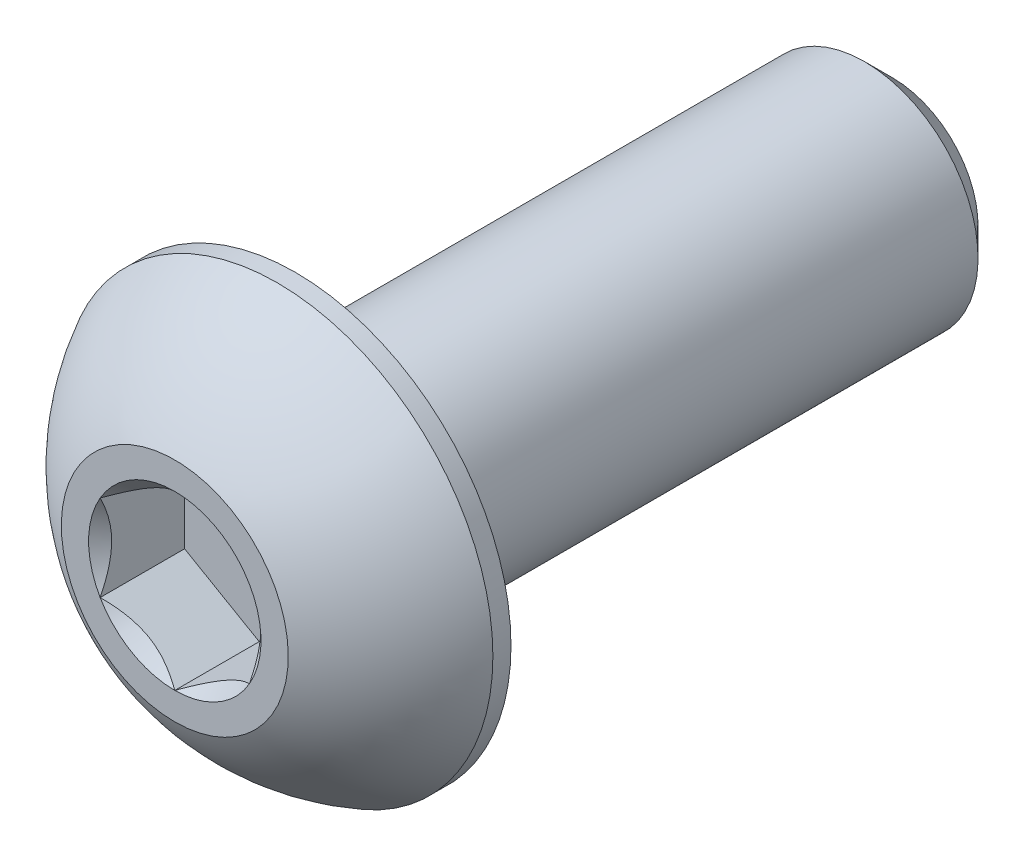
ISO-10303-21;
HEADER;
FILE_DESCRIPTION(('STEP AP214'),'2;1');
FILE_NAME('part.step','',(''),(''),'','','');
FILE_SCHEMA(('AUTOMOTIVE_DESIGN { 1 0 10303 214 1 1 1 1 }'));
ENDSEC;
DATA;
#1=APPLICATION_CONTEXT('core data for automotive mechanical design processes');
#2=APPLICATION_PROTOCOL_DEFINITION('international standard','automotive_design',2000,#1);
#3=PRODUCT_CONTEXT('',#1,'mechanical');
#4=PRODUCT('Part','Part','',(#3));
#5=PRODUCT_RELATED_PRODUCT_CATEGORY('part','',(#4));
#6=PRODUCT_DEFINITION_FORMATION('','',#4);
#7=PRODUCT_DEFINITION_CONTEXT('part definition',#1,'design');
#8=PRODUCT_DEFINITION('design','',#6,#7);
#9=PRODUCT_DEFINITION_SHAPE('','',#8);
#10=(LENGTH_UNIT() NAMED_UNIT(*) SI_UNIT(.MILLI.,.METRE.));
#11=(NAMED_UNIT(*) PLANE_ANGLE_UNIT() SI_UNIT($,.RADIAN.));
#12=(NAMED_UNIT(*) SI_UNIT($,.STERADIAN.) SOLID_ANGLE_UNIT());
#13=UNCERTAINTY_MEASURE_WITH_UNIT(LENGTH_MEASURE(1.E-05),#10,'distance_accuracy_value','');
#14=(GEOMETRIC_REPRESENTATION_CONTEXT(3) GLOBAL_UNCERTAINTY_ASSIGNED_CONTEXT((#13)) GLOBAL_UNIT_ASSIGNED_CONTEXT((#10,
#11,#12)) REPRESENTATION_CONTEXT('',''));
#15=CARTESIAN_POINT('',(0.,0.,0.));
#16=DIRECTION('',(0.,0.,1.));
#17=DIRECTION('',(1.,0.,0.));
#18=AXIS2_PLACEMENT_3D('',#15,#16,#17);
#19=CARTESIAN_POINT('',(0.,-2.41300000000001,-15.2654));
#20=DIRECTION('',(0.,0.,-1.));
#21=DIRECTION('',(0.,1.,0.));
#22=AXIS2_PLACEMENT_3D('',#19,#20,#21);
#23=PLANE('',#22);
#24=CARTESIAN_POINT('',(0.,0.,-15.2654));
#25=DIRECTION('',(0.,0.,-1.));
#26=DIRECTION('',(0.,1.,0.));
#27=AXIS2_PLACEMENT_3D('',#24,#25,#26);
#28=CIRCLE('',#27,1.81768750000001);
#29=CARTESIAN_POINT('',(0.,1.8176875,-15.2654));
#30=VERTEX_POINT('',#29);
#31=EDGE_CURVE('E44',#30,#30,#28,.T.);
#32=ORIENTED_EDGE('',*,*,#31,.T.);
#33=EDGE_LOOP('',(#32));
#34=FACE_BOUND('',#33,.T.);
#35=ADVANCED_FACE('F36',(#34),#23,.T.);
#36=CARTESIAN_POINT('',(0.,0.,-15.2654));
#37=DIRECTION('',(0.,0.,-1.));
#38=DIRECTION('',(0.,1.,0.));
#39=AXIS2_PLACEMENT_3D('',#36,#37,#38);
#40=CYLINDRICAL_SURFACE('',#39,2.413);
#41=CARTESIAN_POINT('',(0.,0.,-14.6700875));
#42=DIRECTION('',(0.,0.,-1.));
#43=DIRECTION('',(0.,1.,0.));
#44=AXIS2_PLACEMENT_3D('',#41,#42,#43);
#45=CIRCLE('',#44,2.413);
#46=CARTESIAN_POINT('',(0.,2.413,-14.6700875));
#47=VERTEX_POINT('',#46);
#48=EDGE_CURVE('E11',#47,#47,#45,.F.);
#49=ORIENTED_EDGE('',*,*,#48,.T.);
#50=EDGE_LOOP('',(#49));
#51=FACE_BOUND('',#50,.T.);
#52=CARTESIAN_POINT('',(0.,0.,-2.5654));
#53=DIRECTION('',(0.,0.,1.));
#54=DIRECTION('',(1.,0.,0.));
#55=AXIS2_PLACEMENT_3D('',#52,#53,#54);
#56=CIRCLE('',#55,2.413);
#57=CARTESIAN_POINT('',(2.413,0.,-2.5654));
#58=VERTEX_POINT('',#57);
#59=EDGE_CURVE('E170',#58,#58,#56,.F.);
#60=ORIENTED_EDGE('',*,*,#59,.T.);
#61=EDGE_LOOP('',(#60));
#62=FACE_BOUND('',#61,.T.);
#63=ADVANCED_FACE('F178',(#51,#62),#40,.T.);
#64=CARTESIAN_POINT('',(0.,0.,-15.2654));
#65=DIRECTION('',(0.,0.,1.));
#66=DIRECTION('',(0.,-1.,0.));
#67=AXIS2_PLACEMENT_3D('',#64,#65,#66);
#68=CONICAL_SURFACE('',#67,1.81768750000001,0.785398163397446);
#69=ORIENTED_EDGE('',*,*,#48,.F.);
#70=EDGE_LOOP('',(#69));
#71=FACE_BOUND('',#70,.T.);
#72=ORIENTED_EDGE('',*,*,#31,.F.);
#73=EDGE_LOOP('',(#72));
#74=FACE_BOUND('',#73,.T.);
#75=ADVANCED_FACE('F38',(#71,#74),#68,.T.);
#76=CARTESIAN_POINT('',(0.,0.,-4.5748806144438));
#77=DIRECTION('',(0.,0.,1.));
#78=DIRECTION('',(0.,-1.,0.));
#79=AXIS2_PLACEMENT_3D('',#76,#77,#78);
#80=SPHERICAL_SURFACE('',#79,5.17224338526463);
#81=CARTESIAN_POINT('',(0.,0.,0.));
#82=DIRECTION('',(0.,0.,1.));
#83=DIRECTION('',(1.,0.,0.));
#84=AXIS2_PLACEMENT_3D('',#81,#82,#83);
#85=CIRCLE('',#84,2.413);
#86=CARTESIAN_POINT('',(0.,-2.413,0.));
#87=VERTEX_POINT('',#86);
#88=EDGE_CURVE('E167',#87,#87,#85,.T.);
#89=CARTESIAN_POINT('',(0.,0.,-2.18059));
#90=DIRECTION('',(0.,0.,1.));
#91=DIRECTION('',(1.,0.,0.));
#92=AXIS2_PLACEMENT_3D('',#89,#90,#91);
#93=CIRCLE('',#92,4.5847);
#94=CARTESIAN_POINT('',(0.,-4.5847,-2.18059));
#95=VERTEX_POINT('',#94);
#96=EDGE_CURVE('E161',#95,#95,#93,.T.);
#97=CARTESIAN_POINT('',(0.,-2.413,0.));
#98=CARTESIAN_POINT('',(0.,-2.44179113663083,-0.0151857097788009));
#99=CARTESIAN_POINT('',(0.,-2.47043888331474,-0.0306432741933343));
#100=CARTESIAN_POINT('',(0.,-2.5274374690351,-0.0620964513369402));
#101=CARTESIAN_POINT('',(0.,-2.55578830807155,-0.0780920640660127));
#102=CARTESIAN_POINT('',(0.,-2.61218295074331,-0.110615676881771));
#103=CARTESIAN_POINT('',(0.,-2.64022675437863,-0.127143676968457));
#104=CARTESIAN_POINT('',(0.,-2.69599733629138,-0.160726162390165));
#105=CARTESIAN_POINT('',(0.,-2.72372411456882,-0.177780647725188));
#106=CARTESIAN_POINT('',(0.,-2.77885076121154,-0.21241002764294));
#107=CARTESIAN_POINT('',(0.,-2.80625062957682,-0.229984922225668));
#108=CARTESIAN_POINT('',(0.,-2.86071369040082,-0.265648855453746));
#109=CARTESIAN_POINT('',(0.,-2.88777688285954,-0.283737894099096));
#110=CARTESIAN_POINT('',(0.,-2.94155694533546,-0.320423667994127));
#111=CARTESIAN_POINT('',(0.,-2.96827381535265,-0.339020403243808));
#112=CARTESIAN_POINT('',(0.,-3.02135171000009,-0.37671494166065));
#113=CARTESIAN_POINT('',(0.,-3.04771273463033,-0.39581274482781));
#114=CARTESIAN_POINT('',(0.,-3.10006954235699,-0.434502611862808));
#115=CARTESIAN_POINT('',(0.,-3.12606532545341,-0.454094675730644));
#116=CARTESIAN_POINT('',(0.,-3.17768238416296,-0.493766080756604));
#117=CARTESIAN_POINT('',(0.,-3.20330365977609,-0.513845421914727));
#118=CARTESIAN_POINT('',(0.,-3.25416257105645,-0.554484224430573));
#119=CARTESIAN_POINT('',(0.,-3.27940020672367,-0.575043685788297));
#120=CARTESIAN_POINT('',(0.,-3.32948284239517,-0.616635400476975));
#121=CARTESIAN_POINT('',(0.,-3.35432784239946,-0.63766765380793));
#122=CARTESIAN_POINT('',(0.,-3.40361635097913,-0.680197455694829));
#123=CARTESIAN_POINT('',(0.,-3.42805985955453,-0.701695004250773));
#124=CARTESIAN_POINT('',(0.,-3.47653667261836,-0.745147733989217));
#125=CARTESIAN_POINT('',(0.,-3.5005699771068,-0.767102915171716));
#126=CARTESIAN_POINT('',(0.,-3.54821781555203,-0.81146308444603));
#127=CARTESIAN_POINT('',(0.,-3.57183234950881,-0.833868072537843));
#128=CARTESIAN_POINT('',(0.,-3.61863422971284,-0.879119869584105));
#129=CARTESIAN_POINT('',(0.,-3.64182157596008,-0.901966678538555));
#130=CARTESIAN_POINT('',(0.,-3.68776081583415,-0.948093973780533));
#131=CARTESIAN_POINT('',(0.,-3.71051270946098,-0.971374460068061));
#132=CARTESIAN_POINT('',(0.,-3.75557293439636,-1.01836081186645));
#133=CARTESIAN_POINT('',(0.,-3.7778812657049,-1.0420666773773));
#134=CARTESIAN_POINT('',(0.,-3.82204641440941,-1.08989533789018));
#135=CARTESIAN_POINT('',(0.,-3.84390323180538,-1.11401813289221));
#136=CARTESIAN_POINT('',(0.,-3.88715756202836,-1.16267205404467));
#137=CARTESIAN_POINT('',(0.,-3.90855507485536,-1.18720318019511));
#138=CARTESIAN_POINT('',(0.,-3.95088316899876,-1.23666501975588));
#139=CARTESIAN_POINT('',(0.,-3.97181375031515,-1.26159573316622));
#140=CARTESIAN_POINT('',(0.,-4.01320052092912,-1.31184786092909));
#141=CARTESIAN_POINT('',(0.,-4.03365671022669,-1.33716927528163));
#142=CARTESIAN_POINT('',(0.,-4.07408740538699,-1.38819377934977));
#143=CARTESIAN_POINT('',(0.,-4.09406191124973,-1.41389686906536));
#144=CARTESIAN_POINT('',(0.,-4.13352211981722,-1.46567556223513));
#145=CARTESIAN_POINT('',(0.,-4.15300782252198,-1.4917511656893));
#146=CARTESIAN_POINT('',(0.,-4.19148347927457,-1.54426559193551));
#147=CARTESIAN_POINT('',(0.,-4.2104734333224,-1.57070441472756));
#148=CARTESIAN_POINT('',(0.,-4.24795082398615,-1.6239358557723));
#149=CARTESIAN_POINT('',(0.,-4.26643826060207,-1.65072847402499));
#150=CARTESIAN_POINT('',(0.,-4.3029040266735,-1.70465795604563));
#151=CARTESIAN_POINT('',(0.,-4.32088235612901,-1.73179481981358));
#152=CARTESIAN_POINT('',(0.,-4.35632349988304,-1.78640312007115));
#153=CARTESIAN_POINT('',(0.,-4.37378631418156,-1.81387455656079));
#154=CARTESIAN_POINT('',(0.,-4.40819020238474,-1.86914221075438));
#155=CARTESIAN_POINT('',(0.,-4.42513127628939,-1.89693842845834));
#156=CARTESIAN_POINT('',(0.,-4.45848564813517,-1.95284573578717));
#157=CARTESIAN_POINT('',(0.,-4.4748989460763,-1.98095682541204));
#158=CARTESIAN_POINT('',(0.,-4.50719190474587,-2.03748386259807));
#159=CARTESIAN_POINT('',(0.,-4.5230715654743,-2.06589981015923));
#160=CARTESIAN_POINT('',(0.,-4.55429163018258,-2.12302641242262));
#161=CARTESIAN_POINT('',(0.,-4.56963203416241,-2.15173706712485));
#162=CARTESIAN_POINT('',(0.,-4.5847,-2.18059));
#163=B_SPLINE_CURVE_WITH_KNOTS('',3,(#97,#98,#99,#100,#101,#102,#103,#104,#105,#106,#107,#108,
#109,#110,#111,#112,#113,#114,#115,#116,#117,#118,#119,#120,#121,#122,#123,#124,#125,#126,#127,
#128,#129,#130,#131,#132,#133,#134,#135,#136,#137,#138,#139,#140,#141,#142,#143,#144,#145,#146,
#147,#148,#149,#150,#151,#152,#153,#154,#155,#156,#157,#158,#159,#160,#161,#162),.UNSPECIFIED.,
.F.,.F.,(4,2,2,2,2,2,2,2,2,2,2,2,2,2,2,2,2,2,2,2,2,2,2,2,2,2,2,2,2,2,2,2,4),(0.,
0.0976500604051489,0.195300120810298,0.292950181215447,0.390600241620598,0.488250302025747,
0.585900362430896,0.683550422836046,0.781200483241194,0.878850543646344,0.976500604051493,
1.07415066445664,1.17180072486179,1.26945078526694,1.36710084567209,1.46475090607724,
1.56240096648239,1.66005102688754,1.75770108729269,1.85535114769784,1.95300120810299,
2.05065126850814,2.14830132891329,2.24595138931843,2.34360144972358,2.44125151012873,
2.53890157053388,2.63655163093903,2.73420169134418,2.83185175174933,2.92950181215448,
3.02715187255963,3.12480193296478),.UNSPECIFIED.);
#164=EDGE_CURVE('BSEAM177',#87,#95,#163,.T.);
#165=ORIENTED_EDGE('',*,*,#88,.F.);
#166=ORIENTED_EDGE('',*,*,#96,.T.);
#167=ORIENTED_EDGE('',*,*,#164,.T.);
#168=ORIENTED_EDGE('',*,*,#164,.F.);
#169=EDGE_LOOP('',(#165,#167,#166,#168));
#170=FACE_BOUND('',#169,.T.);
#171=ADVANCED_FACE('F177',(#170),#80,.T.);
#172=CARTESIAN_POINT('',(0.,-2.413,0.));
#173=DIRECTION('',(0.,0.,-1.));
#174=DIRECTION('',(-1.,0.,0.));
#175=AXIS2_PLACEMENT_3D('',#172,#173,#174);
#176=PLANE('',#175);
#177=CARTESIAN_POINT('',(0.,0.,0.));
#178=DIRECTION('',(0.,0.,1.));
#179=DIRECTION('',(1.,0.,0.));
#180=AXIS2_PLACEMENT_3D('',#177,#178,#179);
#181=CIRCLE('',#180,1.83308710467706);
#182=CARTESIAN_POINT('',(-1.5875,0.916543552338531,0.));
#183=VERTEX_POINT('',#182);
#184=CARTESIAN_POINT('',(-1.5875,-0.916543552338532,0.));
#185=VERTEX_POINT('',#184);
#186=EDGE_CURVE('E57',#183,#185,#181,.T.);
#187=ORIENTED_EDGE('',*,*,#186,.F.);
#188=CARTESIAN_POINT('',(0.,1.83308710467706,0.));
#189=VERTEX_POINT('',#188);
#190=EDGE_CURVE('E131',#189,#183,#181,.T.);
#191=ORIENTED_EDGE('',*,*,#190,.F.);
#192=CARTESIAN_POINT('',(1.5875,0.916543552338531,0.));
#193=VERTEX_POINT('',#192);
#194=EDGE_CURVE('E108',#193,#189,#181,.T.);
#195=ORIENTED_EDGE('',*,*,#194,.F.);
#196=CARTESIAN_POINT('',(1.5875,-0.916543552338531,0.));
#197=VERTEX_POINT('',#196);
#198=EDGE_CURVE('E97',#197,#193,#181,.T.);
#199=ORIENTED_EDGE('',*,*,#198,.F.);
#200=CARTESIAN_POINT('',(0.,-1.83308710467706,0.));
#201=VERTEX_POINT('',#200);
#202=EDGE_CURVE('E89',#201,#197,#181,.T.);
#203=ORIENTED_EDGE('',*,*,#202,.F.);
#204=EDGE_CURVE('E50',#185,#201,#181,.T.);
#205=ORIENTED_EDGE('',*,*,#204,.F.);
#206=EDGE_LOOP('',(#187,#191,#195,#199,#203,#205));
#207=FACE_BOUND('',#206,.T.);
#208=ORIENTED_EDGE('',*,*,#88,.T.);
#209=EDGE_LOOP('',(#208));
#210=FACE_BOUND('',#209,.T.);
#211=ADVANCED_FACE('F128',(#207,#210),#176,.F.);
#212=CARTESIAN_POINT('',(0.,-4.5847,-2.5654));
#213=DIRECTION('',(0.,0.,1.));
#214=DIRECTION('',(1.,0.,0.));
#215=AXIS2_PLACEMENT_3D('',#212,#213,#214);
#216=PLANE('',#215);
#217=ORIENTED_EDGE('',*,*,#59,.F.);
#218=EDGE_LOOP('',(#217));
#219=FACE_BOUND('',#218,.T.);
#220=CARTESIAN_POINT('',(0.,0.,-2.5654));
#221=DIRECTION('',(0.,0.,1.));
#222=DIRECTION('',(1.,0.,0.));
#223=AXIS2_PLACEMENT_3D('',#220,#221,#222);
#224=CIRCLE('',#223,4.5847);
#225=CARTESIAN_POINT('',(4.5847,0.,-2.5654));
#226=VERTEX_POINT('',#225);
#227=EDGE_CURVE('E164',#226,#226,#224,.T.);
#228=ORIENTED_EDGE('',*,*,#227,.F.);
#229=EDGE_LOOP('',(#228));
#230=FACE_BOUND('',#229,.T.);
#231=ADVANCED_FACE('F195',(#219,#230),#216,.F.);
#232=CARTESIAN_POINT('',(0.,0.,0.));
#233=DIRECTION('',(0.,0.,1.));
#234=DIRECTION('',(1.,0.,0.));
#235=AXIS2_PLACEMENT_3D('',#232,#233,#234);
#236=CYLINDRICAL_SURFACE('',#235,4.5847);
#237=ORIENTED_EDGE('',*,*,#96,.F.);
#238=EDGE_LOOP('',(#237));
#239=FACE_BOUND('',#238,.T.);
#240=ORIENTED_EDGE('',*,*,#227,.T.);
#241=EDGE_LOOP('',(#240));
#242=FACE_BOUND('',#241,.T.);
#243=ADVANCED_FACE('F198',(#239,#242),#236,.T.);
#244=CARTESIAN_POINT('',(0.,0.,0.));
#245=DIRECTION('',(0.,0.,1.));
#246=DIRECTION('',(1.,0.,0.));
#247=AXIS2_PLACEMENT_3D('',#244,#245,#246);
#248=CONICAL_SURFACE('',#247,1.83308710467706,0.78539816339745);
#249=ORIENTED_EDGE('',*,*,#198,.T.);
#250=CARTESIAN_POINT('',(1.5875,-1.83163614232864,0.590762562254563));
#251=CARTESIAN_POINT('',(1.5875,-1.78705354844902,0.557077854803239));
#252=CARTESIAN_POINT('',(1.5875,-1.74222294150554,0.523722329968626));
#253=CARTESIAN_POINT('',(1.5875,-1.65196486784504,0.457805675888284));
#254=CARTESIAN_POINT('',(1.5875,-1.60653725449664,0.425244747634467));
#255=CARTESIAN_POINT('',(1.5875,-1.46854281940082,0.328493449461235));
#256=CARTESIAN_POINT('',(1.5875,-1.37494211623385,0.265753264612857));
#257=CARTESIAN_POINT('',(1.5875,-1.17864136265694,0.142553151294644));
#258=CARTESIAN_POINT('',(1.5875,-1.07572731596385,0.0824303289226483));
#259=CARTESIAN_POINT('',(1.5875,-0.864754189558117,-0.0275706334490083));
#260=CARTESIAN_POINT('',(1.5875,-0.756714033301438,-0.0774833149376717));
#261=CARTESIAN_POINT('',(1.5875,-0.594580029688666,-0.138547963751185));
#262=CARTESIAN_POINT('',(1.5875,-0.542894373932897,-0.156067797502568));
#263=CARTESIAN_POINT('',(1.5875,-0.43827206291756,-0.186958420156953));
#264=CARTESIAN_POINT('',(1.5875,-0.3853353220534,-0.200328924255393));
#265=CARTESIAN_POINT('',(1.5875,-0.279413400734369,-0.222002681044568));
#266=CARTESIAN_POINT('',(1.5875,-0.226446313904206,-0.230392976800141));
#267=CARTESIAN_POINT('',(1.5875,-0.119941637592404,-0.241941911012322));
#268=CARTESIAN_POINT('',(1.5875,-0.066404148626323,-0.245101456366562));
#269=CARTESIAN_POINT('',(1.5875,0.0387581192420282,-0.245952982965122));
#270=CARTESIAN_POINT('',(1.5875,0.0903813815542163,-0.243840334608509));
#271=CARTESIAN_POINT('',(1.5875,0.19318730201683,-0.234695846678065));
#272=CARTESIAN_POINT('',(1.5875,0.244369916988517,-0.227663530460197));
#273=CARTESIAN_POINT('',(1.5875,0.346790527788956,-0.208944949355169));
#274=CARTESIAN_POINT('',(1.5875,0.398013804172139,-0.197179358640977));
#275=CARTESIAN_POINT('',(1.5875,0.499340680307277,-0.169620657149212));
#276=CARTESIAN_POINT('',(1.5875,0.549444372105894,-0.153827878801824));
#277=CARTESIAN_POINT('',(1.5875,0.707022639586408,-0.0982133790717419));
#278=CARTESIAN_POINT('',(1.5875,0.812258737570578,-0.0520647672653369));
#279=CARTESIAN_POINT('',(1.5875,1.01778869013701,0.0505458403808824));
#280=CARTESIAN_POINT('',(1.5875,1.11806310933257,0.107044855107553));
#281=CARTESIAN_POINT('',(1.5875,1.30970442577157,0.223612502972616));
#282=CARTESIAN_POINT('',(1.5875,1.40126637149297,0.283364441978613));
#283=CARTESIAN_POINT('',(1.5875,1.53616443073865,0.37573700869171));
#284=CARTESIAN_POINT('',(1.5875,1.58054835823549,0.406854014274728));
#285=CARTESIAN_POINT('',(1.5875,1.66870952512132,0.469911550181166));
#286=CARTESIAN_POINT('',(1.5875,1.71248692801697,0.501851851647461));
#287=CARTESIAN_POINT('',(1.5875,1.75601179240957,0.53413355784713));
#288=B_SPLINE_CURVE_WITH_KNOTS('',3,(#250,#251,#252,#253,#254,#255,#256,#257,#258,#259,#260,
#261,#262,#263,#264,#265,#266,#267,#268,#269,#270,#271,#272,#273,#274,#275,#276,#277,#278,#279,
#280,#281,#282,#283,#284,#285,#286,#287),.UNSPECIFIED.,.F.,.F.,(4,2,2,2,2,2,2,2,2,2,2,2,2,2,2,2,
2,2,4),(0.,0.167627505127548,0.335296980846479,0.673194674702937,1.0304700708717,
1.38651603079307,1.55010049300857,1.71369618096554,1.87434127467533,2.034958513124,
2.18971280484453,2.34448209207484,2.50196108385089,2.65942708049529,3.00314617711216,
3.34811949873714,3.67595792169729,3.83856722085481,4.00113179576279),.UNSPECIFIED.);
#289=EDGE_CURVE('E102',#197,#193,#288,.T.);
#290=ORIENTED_EDGE('',*,*,#289,.F.);
#291=EDGE_LOOP('',(#249,#290));
#292=FACE_BOUND('',#291,.T.);
#293=ADVANCED_FACE('F103',(#292),#248,.F.);
#294=ORIENTED_EDGE('',*,*,#194,.T.);
#295=CARTESIAN_POINT('',(1.5877,0.916428082284693,0.000115480963706747));
#296=CARTESIAN_POINT('',(1.53312479190086,0.947937093371809,-0.0313691916294031));
#297=CARTESIAN_POINT('',(1.47763696320971,0.979973006203395,-0.06100495398647));
#298=CARTESIAN_POINT('',(1.36449087915364,1.04529792829092,-0.115267739979175));
#299=CARTESIAN_POINT('',(1.30682185887062,1.07859315267522,-0.139864564866823));
#300=CARTESIAN_POINT('',(1.1905349781269,1.14573141457583,-0.181999635727418));
#301=CARTESIAN_POINT('',(1.13194674474407,1.17955734689075,-0.199643807270178));
#302=CARTESIAN_POINT('',(1.01348022674557,1.24795402294714,-0.226828529915031));
#303=CARTESIAN_POINT('',(0.953605562983895,1.28252267618758,-0.236389379304923));
#304=CARTESIAN_POINT('',(0.850418771876558,1.34209759781022,-0.245015586895992));
#305=CARTESIAN_POINT('',(0.807240015952288,1.36702686416637,-0.246292807190424));
#306=CARTESIAN_POINT('',(0.720953038535399,1.41684467380557,-0.244142944185295));
#307=CARTESIAN_POINT('',(0.677844847078612,1.44173319974742,-0.240714211450657));
#308=CARTESIAN_POINT('',(0.592046335002031,1.49126899379091,-0.229349005566657));
#309=CARTESIAN_POINT('',(0.549356408925407,1.51591603410293,-0.221408628198358));
#310=CARTESIAN_POINT('',(0.464693063478359,1.56479643938728,-0.201451585548899));
#311=CARTESIAN_POINT('',(0.422719959755075,1.58902962212064,-0.189433170791309));
#312=CARTESIAN_POINT('',(0.315211458113567,1.65109968448354,-0.153753102752754));
#313=CARTESIAN_POINT('',(0.2503427717089,1.68855163804125,-0.127401427696863));
#314=CARTESIAN_POINT('',(0.154961599380924,1.74361998356043,-0.082916463148298));
#315=CARTESIAN_POINT('',(0.123530699536157,1.76176662204668,-0.0672871421988685));
#316=CARTESIAN_POINT('',(0.0612469855696369,1.79772614107138,-0.0346015121388986));
#317=CARTESIAN_POINT('',(0.0303939039605764,1.8155391760437,-0.0175458843430301));
#318=CARTESIAN_POINT('',(-0.000200000000000335,1.8332025747309,0.000115480963706747));
#319=B_SPLINE_CURVE_WITH_KNOTS('',3,(#295,#296,#297,#298,#299,#300,#301,#302,#303,#304,#305,
#306,#307,#308,#309,#310,#311,#312,#313,#314,#315,#316,#317,#318),.UNSPECIFIED.,.F.,.F.,(4,2,2,
2,2,2,2,2,2,2,2,4),(0.,0.211482650810816,0.424197870807276,0.633533884524815,0.842342653263347,
0.99175555372714,1.14122083674204,1.29081565918877,1.44047473906437,1.6781878086972,
1.79671410024894,1.91518409436631),.UNSPECIFIED.);
#320=EDGE_CURVE('E107',#193,#189,#319,.T.);
#321=ORIENTED_EDGE('',*,*,#320,.F.);
#322=EDGE_LOOP('',(#294,#321));
#323=FACE_BOUND('',#322,.T.);
#324=ADVANCED_FACE('F283',(#323),#248,.F.);
#325=ORIENTED_EDGE('',*,*,#190,.T.);
#326=CARTESIAN_POINT('',(0.000199999999999625,1.8332025747309,0.000115480963706835));
#327=CARTESIAN_POINT('',(-0.0543752080991368,1.80169356364378,-0.0313691916294032));
#328=CARTESIAN_POINT('',(-0.10986303679029,1.7696576508122,-0.0610049539864701));
#329=CARTESIAN_POINT('',(-0.223009120846359,1.70433272872467,-0.115267739979175));
#330=CARTESIAN_POINT('',(-0.280678141129381,1.67103750434037,-0.139864564866824));
#331=CARTESIAN_POINT('',(-0.396965021873104,1.60389924243976,-0.181999635727418));
#332=CARTESIAN_POINT('',(-0.455553255255932,1.57007331012484,-0.199643807270178));
#333=CARTESIAN_POINT('',(-0.574019773254431,1.50167663406845,-0.226828529915031));
#334=CARTESIAN_POINT('',(-0.633894437016106,1.46710798082801,-0.236389379304923));
#335=CARTESIAN_POINT('',(-0.737081228123443,1.40753305920537,-0.245015586895992));
#336=CARTESIAN_POINT('',(-0.780259984047713,1.38260379284922,-0.246292807190424));
#337=CARTESIAN_POINT('',(-0.866546961464602,1.33278598321002,-0.244142944185296));
#338=CARTESIAN_POINT('',(-0.909655152921389,1.30789745726817,-0.240714211450657));
#339=CARTESIAN_POINT('',(-0.99545366499797,1.25836166322468,-0.229349005566656));
#340=CARTESIAN_POINT('',(-1.03814359107459,1.23371462291266,-0.221408628198358));
#341=CARTESIAN_POINT('',(-1.12280693652164,1.18483421762831,-0.201451585548899));
#342=CARTESIAN_POINT('',(-1.16478004024493,1.16060103489495,-0.189433170791309));
#343=CARTESIAN_POINT('',(-1.27228854188643,1.09853097253205,-0.153753102752754));
#344=CARTESIAN_POINT('',(-1.3371572282911,1.06107901897434,-0.127401427696863));
#345=CARTESIAN_POINT('',(-1.43253840061908,1.00601067345516,-0.0829164631482982));
#346=CARTESIAN_POINT('',(-1.46396930046384,0.987864034968913,-0.0672871421988688));
#347=CARTESIAN_POINT('',(-1.52625301443036,0.951904515944214,-0.0346015121388989));
#348=CARTESIAN_POINT('',(-1.55710609603942,0.934091480971893,-0.0175458843430305));
#349=CARTESIAN_POINT('',(-1.5877,0.916428082284693,0.000115480963706338));
#350=B_SPLINE_CURVE_WITH_KNOTS('',3,(#326,#327,#328,#329,#330,#331,#332,#333,#334,#335,#336,
#337,#338,#339,#340,#341,#342,#343,#344,#345,#346,#347,#348,#349),.UNSPECIFIED.,.F.,.F.,(4,2,2,
2,2,2,2,2,2,2,2,4),(0.,0.211482650810816,0.424197870807276,0.633533884524816,0.842342653263349,
0.991755553727142,1.14122083674205,1.29081565918877,1.44047473906438,1.6781878086972,
1.79671410024894,1.91518409436631),.UNSPECIFIED.);
#351=EDGE_CURVE('E138',#189,#183,#350,.T.);
#352=ORIENTED_EDGE('',*,*,#351,.F.);
#353=EDGE_LOOP('',(#325,#352));
#354=FACE_BOUND('',#353,.T.);
#355=ADVANCED_FACE('F136',(#354),#248,.F.);
#356=ORIENTED_EDGE('',*,*,#186,.T.);
#357=CARTESIAN_POINT('',(-1.5875,-1.83163614232865,0.590762562254564));
#358=CARTESIAN_POINT('',(-1.5875,-1.78705354844902,0.55707785480324));
#359=CARTESIAN_POINT('',(-1.5875,-1.74222294150555,0.523722329968627));
#360=CARTESIAN_POINT('',(-1.5875,-1.65196486784504,0.457805675888285));
#361=CARTESIAN_POINT('',(-1.5875,-1.60653725449665,0.425244747634468));
#362=CARTESIAN_POINT('',(-1.5875,-1.46854281940082,0.328493449461235));
#363=CARTESIAN_POINT('',(-1.5875,-1.37494211623386,0.265753264612857));
#364=CARTESIAN_POINT('',(-1.5875,-1.17864136265695,0.142553151294644));
#365=CARTESIAN_POINT('',(-1.5875,-1.07572731596385,0.0824303289226481));
#366=CARTESIAN_POINT('',(-1.5875,-0.864754189558117,-0.0275706334490085));
#367=CARTESIAN_POINT('',(-1.5875,-0.756714033301438,-0.0774833149376719));
#368=CARTESIAN_POINT('',(-1.5875,-0.594580029688666,-0.138547963751186));
#369=CARTESIAN_POINT('',(-1.5875,-0.542894373932898,-0.156067797502569));
#370=CARTESIAN_POINT('',(-1.5875,-0.43827206291756,-0.186958420156954));
#371=CARTESIAN_POINT('',(-1.5875,-0.3853353220534,-0.200328924255393));
#372=CARTESIAN_POINT('',(-1.5875,-0.27941340073437,-0.222002681044568));
#373=CARTESIAN_POINT('',(-1.5875,-0.226446313904207,-0.230392976800141));
#374=CARTESIAN_POINT('',(-1.5875,-0.119941637592404,-0.241941911012323));
#375=CARTESIAN_POINT('',(-1.5875,-0.0664041486263238,-0.245101456366563));
#376=CARTESIAN_POINT('',(-1.5875,0.0387581192420274,-0.245952982965122));
#377=CARTESIAN_POINT('',(-1.5875,0.0903813815542155,-0.24384033460851));
#378=CARTESIAN_POINT('',(-1.5875,0.193187302016829,-0.234695846678065));
#379=CARTESIAN_POINT('',(-1.5875,0.244369916988516,-0.227663530460198));
#380=CARTESIAN_POINT('',(-1.5875,0.346790527788956,-0.208944949355169));
#381=CARTESIAN_POINT('',(-1.5875,0.398013804172139,-0.197179358640978));
#382=CARTESIAN_POINT('',(-1.5875,0.499340680307276,-0.169620657149213));
#383=CARTESIAN_POINT('',(-1.5875,0.549444372105894,-0.153827878801825));
#384=CARTESIAN_POINT('',(-1.5875,0.707022639586407,-0.0982133790717423));
#385=CARTESIAN_POINT('',(-1.5875,0.812258737570578,-0.0520647672653373));
#386=CARTESIAN_POINT('',(-1.5875,1.01778869013701,0.0505458403808818));
#387=CARTESIAN_POINT('',(-1.5875,1.11806310933256,0.107044855107552));
#388=CARTESIAN_POINT('',(-1.5875,1.30970442577157,0.223612502972616));
#389=CARTESIAN_POINT('',(-1.5875,1.40126637149297,0.283364441978612));
#390=CARTESIAN_POINT('',(-1.5875,1.53616443073864,0.375737008691709));
#391=CARTESIAN_POINT('',(-1.5875,1.58054835823549,0.406854014274728));
#392=CARTESIAN_POINT('',(-1.5875,1.66870952512132,0.469911550181165));
#393=CARTESIAN_POINT('',(-1.5875,1.71248692801697,0.501851851647461));
#394=CARTESIAN_POINT('',(-1.5875,1.75601179240957,0.53413355784713));
#395=B_SPLINE_CURVE_WITH_KNOTS('',3,(#357,#358,#359,#360,#361,#362,#363,#364,#365,#366,#367,
#368,#369,#370,#371,#372,#373,#374,#375,#376,#377,#378,#379,#380,#381,#382,#383,#384,#385,#386,
#387,#388,#389,#390,#391,#392,#393,#394),.UNSPECIFIED.,.F.,.F.,(4,2,2,2,2,2,2,2,2,2,2,2,2,2,2,2,
2,2,4),(0.,0.167627505127548,0.33529698084648,0.673194674702938,1.0304700708717,
1.38651603079307,1.55010049300858,1.71369618096554,1.87434127467533,2.034958513124,
2.18971280484453,2.34448209207484,2.50196108385089,2.65942708049529,3.00314617711216,
3.34811949873714,3.6759579216973,3.83856722085481,4.00113179576279),.UNSPECIFIED.);
#396=EDGE_CURVE('E142',#183,#185,#395,.F.);
#397=ORIENTED_EDGE('',*,*,#396,.F.);
#398=EDGE_LOOP('',(#356,#397));
#399=FACE_BOUND('',#398,.T.);
#400=ADVANCED_FACE('F277',(#399),#248,.F.);
#401=ORIENTED_EDGE('',*,*,#204,.T.);
#402=CARTESIAN_POINT('',(-1.5877,-0.916428082284693,0.000115480963706314));
#403=CARTESIAN_POINT('',(-1.53312479190086,-0.947937093371809,-0.0313691916294034));
#404=CARTESIAN_POINT('',(-1.47763696320971,-0.979973006203395,-0.0610049539864703));
#405=CARTESIAN_POINT('',(-1.36449087915364,-1.04529792829092,-0.115267739979175));
#406=CARTESIAN_POINT('',(-1.30682185887062,-1.07859315267522,-0.139864564866824));
#407=CARTESIAN_POINT('',(-1.1905349781269,-1.14573141457583,-0.181999635727418));
#408=CARTESIAN_POINT('',(-1.13194674474407,-1.17955734689075,-0.199643807270178));
#409=CARTESIAN_POINT('',(-1.01348022674557,-1.24795402294714,-0.226828529915031));
#410=CARTESIAN_POINT('',(-0.953605562983895,-1.28252267618758,-0.236389379304923));
#411=CARTESIAN_POINT('',(-0.850418771876557,-1.34209759781022,-0.245015586895992));
#412=CARTESIAN_POINT('',(-0.807240015952288,-1.36702686416637,-0.246292807190424));
#413=CARTESIAN_POINT('',(-0.720953038535399,-1.41684467380557,-0.244142944185296));
#414=CARTESIAN_POINT('',(-0.677844847078612,-1.44173319974742,-0.240714211450657));
#415=CARTESIAN_POINT('',(-0.592046335002031,-1.49126899379091,-0.229349005566657));
#416=CARTESIAN_POINT('',(-0.549356408925406,-1.51591603410293,-0.221408628198358));
#417=CARTESIAN_POINT('',(-0.464693063478359,-1.56479643938728,-0.201451585548899));
#418=CARTESIAN_POINT('',(-0.422719959755075,-1.58902962212064,-0.189433170791309));
#419=CARTESIAN_POINT('',(-0.315211458113566,-1.65109968448354,-0.153753102752754));
#420=CARTESIAN_POINT('',(-0.2503427717089,-1.68855163804125,-0.127401427696864));
#421=CARTESIAN_POINT('',(-0.154961599380924,-1.74361998356043,-0.0829164631482981));
#422=CARTESIAN_POINT('',(-0.123530699536157,-1.76176662204668,-0.0672871421988687));
#423=CARTESIAN_POINT('',(-0.0612469855696368,-1.79772614107138,-0.0346015121388988));
#424=CARTESIAN_POINT('',(-0.0303939039605762,-1.8155391760437,-0.0175458843430303));
#425=CARTESIAN_POINT('',(0.000200000000000577,-1.8332025747309,0.000115480963706654));
#426=B_SPLINE_CURVE_WITH_KNOTS('',3,(#402,#403,#404,#405,#406,#407,#408,#409,#410,#411,#412,
#413,#414,#415,#416,#417,#418,#419,#420,#421,#422,#423,#424,#425),.UNSPECIFIED.,.F.,.F.,(4,2,2,
2,2,2,2,2,2,2,2,4),(0.,0.211482650810816,0.424197870807276,0.633533884524815,0.842342653263347,
0.99175555372714,1.14122083674204,1.29081565918877,1.44047473906437,1.6781878086972,
1.79671410024894,1.91518409436631),.UNSPECIFIED.);
#427=EDGE_CURVE('E118',#185,#201,#426,.T.);
#428=ORIENTED_EDGE('',*,*,#427,.F.);
#429=EDGE_LOOP('',(#401,#428));
#430=FACE_BOUND('',#429,.T.);
#431=ADVANCED_FACE('F225',(#430),#248,.F.);
#432=ORIENTED_EDGE('',*,*,#202,.T.);
#433=CARTESIAN_POINT('',(-0.000199999999999235,-1.8332025747309,0.000115480963706835));
#434=CARTESIAN_POINT('',(0.0543752080991371,-1.80169356364378,-0.0313691916294032));
#435=CARTESIAN_POINT('',(0.109863036790291,-1.7696576508122,-0.0610049539864701));
#436=CARTESIAN_POINT('',(0.223009120846359,-1.70433272872467,-0.115267739979175));
#437=CARTESIAN_POINT('',(0.280678141129382,-1.67103750434037,-0.139864564866824));
#438=CARTESIAN_POINT('',(0.396965021873104,-1.60389924243976,-0.181999635727418));
#439=CARTESIAN_POINT('',(0.455553255255931,-1.57007331012484,-0.199643807270178));
#440=CARTESIAN_POINT('',(0.574019773254431,-1.50167663406845,-0.226828529915031));
#441=CARTESIAN_POINT('',(0.633894437016105,-1.46710798082801,-0.236389379304923));
#442=CARTESIAN_POINT('',(0.737081228123443,-1.40753305920537,-0.245015586895992));
#443=CARTESIAN_POINT('',(0.780259984047712,-1.38260379284922,-0.246292807190424));
#444=CARTESIAN_POINT('',(0.866546961464601,-1.33278598321002,-0.244142944185295));
#445=CARTESIAN_POINT('',(0.909655152921388,-1.30789745726817,-0.240714211450657));
#446=CARTESIAN_POINT('',(0.995453664997969,-1.25836166322468,-0.229349005566657));
#447=CARTESIAN_POINT('',(1.03814359107459,-1.23371462291266,-0.221408628198358));
#448=CARTESIAN_POINT('',(1.12280693652164,-1.18483421762831,-0.201451585548899));
#449=CARTESIAN_POINT('',(1.16478004024493,-1.16060103489495,-0.189433170791309));
#450=CARTESIAN_POINT('',(1.27228854188643,-1.09853097253205,-0.153753102752754));
#451=CARTESIAN_POINT('',(1.3371572282911,-1.06107901897434,-0.127401427696864));
#452=CARTESIAN_POINT('',(1.43253840061908,-1.00601067345516,-0.0829164631482982));
#453=CARTESIAN_POINT('',(1.46396930046384,-0.987864034968913,-0.0672871421988686));
#454=CARTESIAN_POINT('',(1.52625301443036,-0.951904515944214,-0.0346015121388986));
#455=CARTESIAN_POINT('',(1.55710609603942,-0.934091480971893,-0.0175458843430301));
#456=CARTESIAN_POINT('',(1.5877,-0.916428082284692,0.000115480963706545));
#457=B_SPLINE_CURVE_WITH_KNOTS('',3,(#433,#434,#435,#436,#437,#438,#439,#440,#441,#442,#443,
#444,#445,#446,#447,#448,#449,#450,#451,#452,#453,#454,#455,#456),.UNSPECIFIED.,.F.,.F.,(4,2,2,
2,2,2,2,2,2,2,2,4),(0.,0.211482650810817,0.424197870807276,0.633533884524815,0.842342653263348,
0.991755553727141,1.14122083674204,1.29081565918877,1.44047473906437,1.6781878086972,
1.79671410024894,1.91518409436631),.UNSPECIFIED.);
#458=EDGE_CURVE('E93',#201,#197,#457,.T.);
#459=ORIENTED_EDGE('',*,*,#458,.F.);
#460=EDGE_LOOP('',(#432,#459));
#461=FACE_BOUND('',#460,.T.);
#462=ADVANCED_FACE('F91',(#461),#248,.F.);
#463=CARTESIAN_POINT('',(1.5875,-0.91654355233853,-1.79578));
#464=DIRECTION('',(0.,0.,1.));
#465=DIRECTION('',(1.,0.,0.));
#466=AXIS2_PLACEMENT_3D('',#463,#464,#465);
#467=PLANE('',#466);
#468=DIRECTION('',(0.866025403784438,0.5,0.));
#469=VECTOR('',#468,1.);
#470=CARTESIAN_POINT('',(0.,-1.83308710467706,-1.79578));
#471=LINE('',#470,#469);
#472=CARTESIAN_POINT('',(0.,-1.83308710467706,-1.79578));
#473=VERTEX_POINT('',#472);
#474=CARTESIAN_POINT('',(1.5875,-0.91654355233853,-1.79578));
#475=VERTEX_POINT('',#474);
#476=EDGE_CURVE('E117',#473,#475,#471,.T.);
#477=ORIENTED_EDGE('',*,*,#476,.T.);
#478=DIRECTION('',(0.,1.,0.));
#479=VECTOR('',#478,1.);
#480=CARTESIAN_POINT('',(1.5875,-0.91654355233853,-1.79578));
#481=LINE('',#480,#479);
#482=CARTESIAN_POINT('',(1.5875,0.916543552338531,-1.79578));
#483=VERTEX_POINT('',#482);
#484=EDGE_CURVE('E122',#475,#483,#481,.T.);
#485=ORIENTED_EDGE('',*,*,#484,.T.);
#486=DIRECTION('',(-0.866025403784439,0.5,0.));
#487=VECTOR('',#486,1.);
#488=CARTESIAN_POINT('',(1.5875,0.916543552338531,-1.79578));
#489=LINE('',#488,#487);
#490=CARTESIAN_POINT('',(0.,1.83308710467706,-1.79578));
#491=VERTEX_POINT('',#490);
#492=EDGE_CURVE('E267',#483,#491,#489,.T.);
#493=ORIENTED_EDGE('',*,*,#492,.T.);
#494=DIRECTION('',(-0.866025403784439,-0.5,0.));
#495=VECTOR('',#494,1.);
#496=CARTESIAN_POINT('',(0.,1.83308710467706,-1.79578));
#497=LINE('',#496,#495);
#498=CARTESIAN_POINT('',(-1.5875,0.916543552338531,-1.79578));
#499=VERTEX_POINT('',#498);
#500=EDGE_CURVE('E152',#491,#499,#497,.T.);
#501=ORIENTED_EDGE('',*,*,#500,.T.);
#502=DIRECTION('',(0.,-1.,0.));
#503=VECTOR('',#502,1.);
#504=CARTESIAN_POINT('',(-1.5875,0.916543552338531,-1.79578));
#505=LINE('',#504,#503);
#506=CARTESIAN_POINT('',(-1.5875,-0.916543552338531,-1.79578));
#507=VERTEX_POINT('',#506);
#508=EDGE_CURVE('E271',#499,#507,#505,.T.);
#509=ORIENTED_EDGE('',*,*,#508,.T.);
#510=DIRECTION('',(0.866025403784439,-0.5,0.));
#511=VECTOR('',#510,1.);
#512=CARTESIAN_POINT('',(-1.5875,-0.916543552338531,-1.79578));
#513=LINE('',#512,#511);
#514=EDGE_CURVE('E125',#507,#473,#513,.T.);
#515=ORIENTED_EDGE('',*,*,#514,.T.);
#516=EDGE_LOOP('',(#477,#485,#493,#501,#509,#515));
#517=FACE_BOUND('',#516,.T.);
#518=ADVANCED_FACE('F224',(#517),#467,.T.);
#519=CARTESIAN_POINT('',(1.5875,-0.91654355233853,-1.79578));
#520=DIRECTION('',(1.,0.,0.));
#521=DIRECTION('',(0.,0.,-1.));
#522=AXIS2_PLACEMENT_3D('',#519,#520,#521);
#523=PLANE('',#522);
#524=DIRECTION('',(0.,0.,1.));
#525=VECTOR('',#524,1.);
#526=CARTESIAN_POINT('',(1.5875,-0.91654355233853,-1.79578));
#527=LINE('',#526,#525);
#528=EDGE_CURVE('E114',#475,#197,#527,.T.);
#529=ORIENTED_EDGE('',*,*,#528,.T.);
#530=ORIENTED_EDGE('',*,*,#289,.T.);
#531=DIRECTION('',(0.,0.,1.));
#532=VECTOR('',#531,1.);
#533=CARTESIAN_POINT('',(1.5875,0.916543552338531,-1.79578));
#534=LINE('',#533,#532);
#535=EDGE_CURVE('E124',#483,#193,#534,.T.);
#536=ORIENTED_EDGE('',*,*,#535,.F.);
#537=ORIENTED_EDGE('',*,*,#484,.F.);
#538=EDGE_LOOP('',(#529,#530,#536,#537));
#539=FACE_BOUND('',#538,.T.);
#540=ADVANCED_FACE('F120',(#539),#523,.F.);
#541=CARTESIAN_POINT('',(1.5875,0.916543552338531,-1.79578));
#542=DIRECTION('',(0.5,0.866025403784439,0.));
#543=DIRECTION('',(-0.866025403784439,0.5,0.));
#544=AXIS2_PLACEMENT_3D('',#541,#542,#543);
#545=PLANE('',#544);
#546=ORIENTED_EDGE('',*,*,#535,.T.);
#547=ORIENTED_EDGE('',*,*,#320,.T.);
#548=DIRECTION('',(0.,0.,1.));
#549=VECTOR('',#548,1.);
#550=CARTESIAN_POINT('',(0.,1.83308710467706,-1.79578));
#551=LINE('',#550,#549);
#552=EDGE_CURVE('E147',#491,#189,#551,.T.);
#553=ORIENTED_EDGE('',*,*,#552,.F.);
#554=ORIENTED_EDGE('',*,*,#492,.F.);
#555=EDGE_LOOP('',(#546,#547,#553,#554));
#556=FACE_BOUND('',#555,.T.);
#557=ADVANCED_FACE('F145',(#556),#545,.F.);
#558=CARTESIAN_POINT('',(0.,1.83308710467706,-1.79578));
#559=DIRECTION('',(-0.5,0.866025403784438,0.));
#560=DIRECTION('',(-0.866025403784438,-0.5,0.));
#561=AXIS2_PLACEMENT_3D('',#558,#559,#560);
#562=PLANE('',#561);
#563=ORIENTED_EDGE('',*,*,#552,.T.);
#564=ORIENTED_EDGE('',*,*,#351,.T.);
#565=DIRECTION('',(0.,0.,1.));
#566=VECTOR('',#565,1.);
#567=CARTESIAN_POINT('',(-1.5875,0.916543552338531,-1.79578));
#568=LINE('',#567,#566);
#569=EDGE_CURVE('E154',#499,#183,#568,.T.);
#570=ORIENTED_EDGE('',*,*,#569,.F.);
#571=ORIENTED_EDGE('',*,*,#500,.F.);
#572=EDGE_LOOP('',(#563,#564,#570,#571));
#573=FACE_BOUND('',#572,.T.);
#574=ADVANCED_FACE('F150',(#573),#562,.F.);
#575=CARTESIAN_POINT('',(-1.5875,0.916543552338531,-1.79578));
#576=DIRECTION('',(-1.,0.,0.));
#577=DIRECTION('',(0.,-1.,0.));
#578=AXIS2_PLACEMENT_3D('',#575,#576,#577);
#579=PLANE('',#578);
#580=ORIENTED_EDGE('',*,*,#569,.T.);
#581=ORIENTED_EDGE('',*,*,#396,.T.);
#582=DIRECTION('',(0.,0.,1.));
#583=VECTOR('',#582,1.);
#584=CARTESIAN_POINT('',(-1.5875,-0.916543552338531,-1.79578));
#585=LINE('',#584,#583);
#586=EDGE_CURVE('E156',#507,#185,#585,.T.);
#587=ORIENTED_EDGE('',*,*,#586,.F.);
#588=ORIENTED_EDGE('',*,*,#508,.F.);
#589=EDGE_LOOP('',(#580,#581,#587,#588));
#590=FACE_BOUND('',#589,.T.);
#591=ADVANCED_FACE('F246',(#590),#579,.F.);
#592=CARTESIAN_POINT('',(-1.5875,-0.916543552338531,-1.79578));
#593=DIRECTION('',(-0.5,-0.866025403784439,0.));
#594=DIRECTION('',(0.866025403784439,-0.5,0.));
#595=AXIS2_PLACEMENT_3D('',#592,#593,#594);
#596=PLANE('',#595);
#597=ORIENTED_EDGE('',*,*,#586,.T.);
#598=ORIENTED_EDGE('',*,*,#427,.T.);
#599=DIRECTION('',(0.,0.,1.));
#600=VECTOR('',#599,1.);
#601=CARTESIAN_POINT('',(0.,-1.83308710467706,-1.79578));
#602=LINE('',#601,#600);
#603=EDGE_CURVE('E116',#473,#201,#602,.T.);
#604=ORIENTED_EDGE('',*,*,#603,.F.);
#605=ORIENTED_EDGE('',*,*,#514,.F.);
#606=EDGE_LOOP('',(#597,#598,#604,#605));
#607=FACE_BOUND('',#606,.T.);
#608=ADVANCED_FACE('F206',(#607),#596,.F.);
#609=CARTESIAN_POINT('',(0.,-1.83308710467706,-1.79578));
#610=DIRECTION('',(0.5,-0.866025403784439,0.));
#611=DIRECTION('',(0.866025403784438,0.5,0.));
#612=AXIS2_PLACEMENT_3D('',#609,#610,#611);
#613=PLANE('',#612);
#614=ORIENTED_EDGE('',*,*,#603,.T.);
#615=ORIENTED_EDGE('',*,*,#458,.T.);
#616=ORIENTED_EDGE('',*,*,#528,.F.);
#617=ORIENTED_EDGE('',*,*,#476,.F.);
#618=EDGE_LOOP('',(#614,#615,#616,#617));
#619=FACE_BOUND('',#618,.T.);
#620=ADVANCED_FACE('F112',(#619),#613,.F.);
#621=CLOSED_SHELL('',(#35,#63,#75,#171,#211,#231,#243,#293,#324,#355,#400,#431,#462,#518,#540,
#557,#574,#591,#608,#620));
#622=MANIFOLD_SOLID_BREP('B2',#621);
#623=ADVANCED_BREP_SHAPE_REPRESENTATION('',(#18,#622),#14);
#624=SHAPE_DEFINITION_REPRESENTATION(#9,#623);
ENDSEC;
END-ISO-10303-21;
